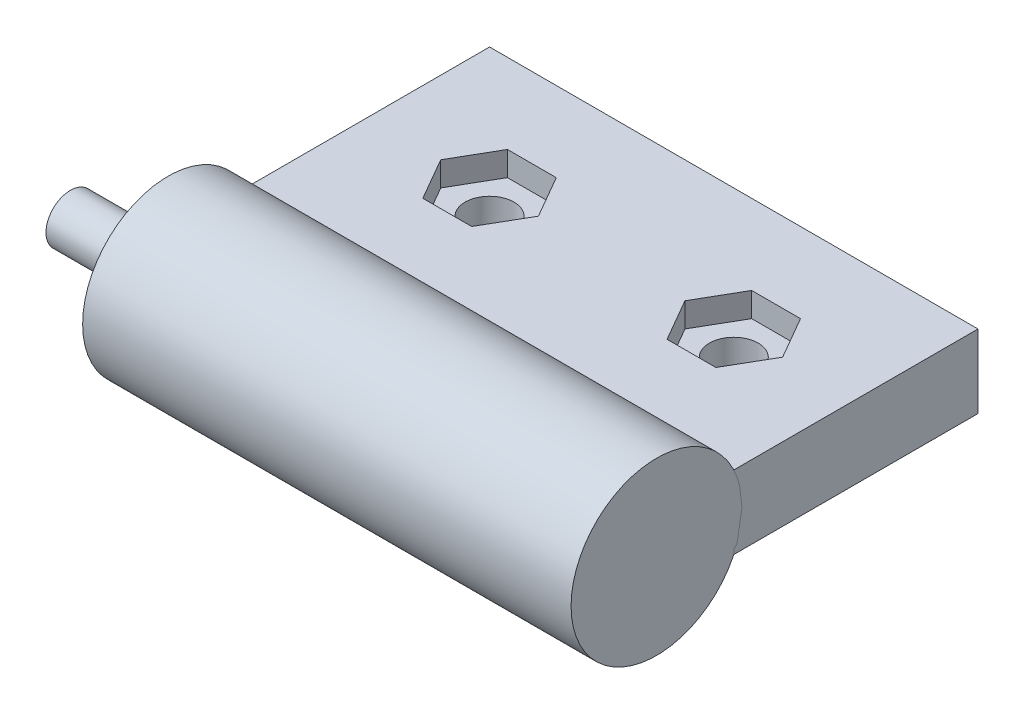
ISO-10303-21;
HEADER;
FILE_DESCRIPTION(('STEP AP214'),'2;1');
FILE_NAME('part.step','',(''),(''),'','','');
FILE_SCHEMA(('AUTOMOTIVE_DESIGN { 1 0 10303 214 1 1 1 1 }'));
ENDSEC;
DATA;
#1=APPLICATION_CONTEXT('core data for automotive mechanical design processes');
#2=APPLICATION_PROTOCOL_DEFINITION('international standard','automotive_design',2000,#1);
#3=PRODUCT_CONTEXT('',#1,'mechanical');
#4=PRODUCT('Part','Part','',(#3));
#5=PRODUCT_RELATED_PRODUCT_CATEGORY('part','',(#4));
#6=PRODUCT_DEFINITION_FORMATION('','',#4);
#7=PRODUCT_DEFINITION_CONTEXT('part definition',#1,'design');
#8=PRODUCT_DEFINITION('design','',#6,#7);
#9=PRODUCT_DEFINITION_SHAPE('','',#8);
#10=(LENGTH_UNIT() NAMED_UNIT(*) SI_UNIT(.MILLI.,.METRE.));
#11=(NAMED_UNIT(*) PLANE_ANGLE_UNIT() SI_UNIT($,.RADIAN.));
#12=(NAMED_UNIT(*) SI_UNIT($,.STERADIAN.) SOLID_ANGLE_UNIT());
#13=UNCERTAINTY_MEASURE_WITH_UNIT(LENGTH_MEASURE(1.E-05),#10,'distance_accuracy_value','');
#14=(GEOMETRIC_REPRESENTATION_CONTEXT(3) GLOBAL_UNCERTAINTY_ASSIGNED_CONTEXT((#13)) GLOBAL_UNIT_ASSIGNED_CONTEXT((#10,
#11,#12)) REPRESENTATION_CONTEXT('',''));
#15=CARTESIAN_POINT('',(0.,0.,0.));
#16=DIRECTION('',(0.,0.,1.));
#17=DIRECTION('',(1.,0.,0.));
#18=AXIS2_PLACEMENT_3D('',#15,#16,#17);
#19=CARTESIAN_POINT('',(-4.94974746830583,0.749999999999999,1.58113883008419));
#20=DIRECTION('',(1.,0.,0.));
#21=DIRECTION('',(0.,0.,-1.));
#22=AXIS2_PLACEMENT_3D('',#19,#20,#21);
#23=CYLINDRICAL_SURFACE('',#22,1.75);
#24=CARTESIAN_POINT('',(0.,0.749999999999999,1.58113883008419));
#25=DIRECTION('',(1.,0.,0.));
#26=DIRECTION('',(0.,0.,-1.));
#27=AXIS2_PLACEMENT_3D('',#24,#25,#26);
#28=CIRCLE('',#27,1.75);
#29=CARTESIAN_POINT('',(0.,0.749999999999999,-0.168861169915811));
#30=VERTEX_POINT('',#29);
#31=EDGE_CURVE('E58',#30,#30,#28,.F.);
#32=ORIENTED_EDGE('',*,*,#31,.F.);
#33=EDGE_LOOP('',(#32));
#34=FACE_BOUND('',#33,.T.);
#35=CARTESIAN_POINT('',(10.,0.749999999999999,1.58113883008419));
#36=DIRECTION('',(1.,0.,0.));
#37=DIRECTION('',(0.,0.,-1.));
#38=AXIS2_PLACEMENT_3D('',#35,#36,#37);
#39=CIRCLE('',#38,1.75);
#40=CARTESIAN_POINT('',(10.,0.749999999999999,-0.168861169915811));
#41=VERTEX_POINT('',#40);
#42=EDGE_CURVE('E68',#41,#41,#39,.T.);
#43=ORIENTED_EDGE('',*,*,#42,.F.);
#44=EDGE_LOOP('',(#43));
#45=FACE_BOUND('',#44,.T.);
#46=ADVANCED_FACE('F55',(#34,#45),#23,.T.);
#47=CARTESIAN_POINT('',(10.,0.749999999999999,1.58113883008419));
#48=DIRECTION('',(1.,0.,0.));
#49=DIRECTION('',(0.,0.,-1.));
#50=AXIS2_PLACEMENT_3D('',#47,#48,#49);
#51=PLANE('',#50);
#52=ORIENTED_EDGE('',*,*,#42,.T.);
#53=EDGE_LOOP('',(#52));
#54=FACE_BOUND('',#53,.T.);
#55=ADVANCED_FACE('F90',(#54),#51,.T.);
#56=CARTESIAN_POINT('',(0.,1.,0.));
#57=DIRECTION('',(1.,0.,0.));
#58=DIRECTION('',(0.,0.,-1.));
#59=AXIS2_PLACEMENT_3D('',#56,#57,#58);
#60=PLANE('',#59);
#61=CARTESIAN_POINT('',(0.,0.749999999999999,1.58113883008419));
#62=DIRECTION('',(-1.,0.,0.));
#63=DIRECTION('',(0.,0.,1.));
#64=AXIS2_PLACEMENT_3D('',#61,#62,#63);
#65=CIRCLE('',#64,0.5);
#66=CARTESIAN_POINT('',(0.,0.749999999999999,2.08113883008419));
#67=VERTEX_POINT('',#66);
#68=EDGE_CURVE('E11',#67,#67,#65,.T.);
#69=ORIENTED_EDGE('',*,*,#68,.F.);
#70=EDGE_LOOP('',(#69));
#71=FACE_BOUND('',#70,.T.);
#72=ORIENTED_EDGE('',*,*,#31,.T.);
#73=EDGE_LOOP('',(#72));
#74=FACE_BOUND('',#73,.T.);
#75=ADVANCED_FACE('F83',(#71,#74),#60,.F.);
#76=CARTESIAN_POINT('',(-2.,0.749999999999999,1.58113883008419));
#77=DIRECTION('',(1.,0.,0.));
#78=DIRECTION('',(0.,0.,-1.));
#79=AXIS2_PLACEMENT_3D('',#76,#77,#78);
#80=CYLINDRICAL_SURFACE('',#79,0.5);
#81=CARTESIAN_POINT('',(-2.,0.749999999999999,1.58113883008419));
#82=DIRECTION('',(-1.,0.,0.));
#83=DIRECTION('',(0.,0.,1.));
#84=AXIS2_PLACEMENT_3D('',#81,#82,#83);
#85=CIRCLE('',#84,0.5);
#86=CARTESIAN_POINT('',(-2.,0.749999999999999,2.08113883008419));
#87=VERTEX_POINT('',#86);
#88=EDGE_CURVE('E70',#87,#87,#85,.T.);
#89=ORIENTED_EDGE('',*,*,#88,.F.);
#90=EDGE_LOOP('',(#89));
#91=FACE_BOUND('',#90,.T.);
#92=ORIENTED_EDGE('',*,*,#68,.T.);
#93=EDGE_LOOP('',(#92));
#94=FACE_BOUND('',#93,.T.);
#95=ADVANCED_FACE('F81',(#91,#94),#80,.T.);
#96=CARTESIAN_POINT('',(-2.,0.749999999999999,1.58113883008419));
#97=DIRECTION('',(-1.,0.,0.));
#98=DIRECTION('',(0.,0.,1.));
#99=AXIS2_PLACEMENT_3D('',#96,#97,#98);
#100=PLANE('',#99);
#101=ORIENTED_EDGE('',*,*,#88,.T.);
#102=EDGE_LOOP('',(#101));
#103=FACE_BOUND('',#102,.T.);
#104=ADVANCED_FACE('F79',(#103),#100,.T.);
#105=CLOSED_SHELL('',(#46,#55,#75,#95,#104));
#106=MANIFOLD_SOLID_BREP('B2',#105);
#107=CARTESIAN_POINT('',(0.,1.,0.));
#108=DIRECTION('',(0.,-1.,0.));
#109=DIRECTION('',(0.,0.,-1.));
#110=AXIS2_PLACEMENT_3D('',#107,#108,#109);
#111=PLANE('',#110);
#112=CARTESIAN_POINT('',(2.5,1.,-2.5));
#113=DIRECTION('',(0.,1.,0.));
#114=DIRECTION('',(0.,0.,1.));
#115=AXIS2_PLACEMENT_3D('',#112,#113,#114);
#116=CIRCLE('',#115,0.5);
#117=CARTESIAN_POINT('',(2.5,1.,-2.));
#118=VERTEX_POINT('',#117);
#119=EDGE_CURVE('E283',#118,#118,#116,.T.);
#120=ORIENTED_EDGE('',*,*,#119,.F.);
#121=EDGE_LOOP('',(#120));
#122=FACE_BOUND('',#121,.T.);
#123=DIRECTION('',(-1.,0.,0.));
#124=VECTOR('',#123,1.);
#125=CARTESIAN_POINT('',(0.,1.,-1.63397459621556));
#126=LINE('',#125,#124);
#127=CARTESIAN_POINT('',(3.,1.,-1.63397459621556));
#128=VERTEX_POINT('',#127);
#129=CARTESIAN_POINT('',(2.,1.,-1.63397459621556));
#130=VERTEX_POINT('',#129);
#131=EDGE_CURVE('E145',#128,#130,#126,.T.);
#132=ORIENTED_EDGE('',*,*,#131,.F.);
#133=DIRECTION('',(0.499999999999998,0.,-0.86602540378444));
#134=VECTOR('',#133,1.);
#135=CARTESIAN_POINT('',(1.54246824526946,1.,0.890544456622768));
#136=LINE('',#135,#134);
#137=CARTESIAN_POINT('',(3.5,1.,-2.5));
#138=VERTEX_POINT('',#137);
#139=EDGE_CURVE('E150',#128,#138,#136,.T.);
#140=ORIENTED_EDGE('',*,*,#139,.T.);
#141=DIRECTION('',(0.499999999999998,0.,0.86602540378444));
#142=VECTOR('',#141,1.);
#143=CARTESIAN_POINT('',(3.70753175473055,1.,-2.14054445662276));
#144=LINE('',#143,#142);
#145=CARTESIAN_POINT('',(3.,1.,-3.36602540378444));
#146=VERTEX_POINT('',#145);
#147=EDGE_CURVE('E360',#146,#138,#144,.T.);
#148=ORIENTED_EDGE('',*,*,#147,.F.);
#149=DIRECTION('',(-1.,0.,0.));
#150=VECTOR('',#149,1.);
#151=CARTESIAN_POINT('',(0.,1.,-3.36602540378444));
#152=LINE('',#151,#150);
#153=CARTESIAN_POINT('',(2.,1.,-3.36602540378444));
#154=VERTEX_POINT('',#153);
#155=EDGE_CURVE('E358',#146,#154,#152,.T.);
#156=ORIENTED_EDGE('',*,*,#155,.T.);
#157=DIRECTION('',(-0.499999999999998,0.,0.86602540378444));
#158=VECTOR('',#157,1.);
#159=CARTESIAN_POINT('',(0.0424682452694592,1.,0.0245190528383332));
#160=LINE('',#159,#158);
#161=CARTESIAN_POINT('',(1.5,1.,-2.5));
#162=VERTEX_POINT('',#161);
#163=EDGE_CURVE('E356',#154,#162,#160,.T.);
#164=ORIENTED_EDGE('',*,*,#163,.T.);
#165=DIRECTION('',(-0.499999999999998,0.,-0.86602540378444));
#166=VECTOR('',#165,1.);
#167=CARTESIAN_POINT('',(2.20753175473055,1.,-1.27451905283832));
#168=LINE('',#167,#166);
#169=EDGE_CURVE('E354',#130,#162,#168,.T.);
#170=ORIENTED_EDGE('',*,*,#169,.F.);
#171=EDGE_LOOP('',(#132,#140,#148,#156,#164,#170));
#172=FACE_BOUND('',#171,.T.);
#173=ADVANCED_FACE('F130',(#122,#172),#111,.F.);
#174=DIRECTION('',(1.,0.,0.));
#175=VECTOR('',#174,1.);
#176=CARTESIAN_POINT('',(0.,1.,-3.36602540378444));
#177=LINE('',#176,#175);
#178=CARTESIAN_POINT('',(7.,1.,-3.36602540378444));
#179=VERTEX_POINT('',#178);
#180=CARTESIAN_POINT('',(8.,1.,-3.36602540378444));
#181=VERTEX_POINT('',#180);
#182=EDGE_CURVE('E366',#179,#181,#177,.T.);
#183=ORIENTED_EDGE('',*,*,#182,.F.);
#184=DIRECTION('',(-0.499999999999999,0.,0.86602540378444));
#185=VECTOR('',#184,1.);
#186=CARTESIAN_POINT('',(3.79246824526947,1.,2.18958256229942));
#187=LINE('',#186,#185);
#188=CARTESIAN_POINT('',(6.5,1.,-2.5));
#189=VERTEX_POINT('',#188);
#190=EDGE_CURVE('E364',#179,#189,#187,.T.);
#191=ORIENTED_EDGE('',*,*,#190,.T.);
#192=DIRECTION('',(-0.499999999999999,0.,-0.86602540378444));
#193=VECTOR('',#192,1.);
#194=CARTESIAN_POINT('',(5.95753175473056,1.,-3.43958256229942));
#195=LINE('',#194,#193);
#196=CARTESIAN_POINT('',(7.,1.,-1.63397459621556));
#197=VERTEX_POINT('',#196);
#198=EDGE_CURVE('E263',#197,#189,#195,.T.);
#199=ORIENTED_EDGE('',*,*,#198,.F.);
#200=DIRECTION('',(1.,0.,0.));
#201=VECTOR('',#200,1.);
#202=CARTESIAN_POINT('',(0.,1.,-1.63397459621556));
#203=LINE('',#202,#201);
#204=CARTESIAN_POINT('',(8.,1.,-1.63397459621556));
#205=VERTEX_POINT('',#204);
#206=EDGE_CURVE('E374',#197,#205,#203,.T.);
#207=ORIENTED_EDGE('',*,*,#206,.T.);
#208=DIRECTION('',(0.499999999999997,0.,-0.86602540378444));
#209=VECTOR('',#208,1.);
#210=CARTESIAN_POINT('',(5.29246824526948,1.,3.05560796608386));
#211=LINE('',#210,#209);
#212=CARTESIAN_POINT('',(8.5,1.,-2.5));
#213=VERTEX_POINT('',#212);
#214=EDGE_CURVE('E372',#205,#213,#211,.T.);
#215=ORIENTED_EDGE('',*,*,#214,.T.);
#216=DIRECTION('',(0.499999999999997,0.,0.86602540378444));
#217=VECTOR('',#216,1.);
#218=CARTESIAN_POINT('',(7.45753175473057,1.,-4.30560796608384));
#219=LINE('',#218,#217);
#220=EDGE_CURVE('E369',#181,#213,#219,.T.);
#221=ORIENTED_EDGE('',*,*,#220,.F.);
#222=EDGE_LOOP('',(#183,#191,#199,#207,#215,#221));
#223=FACE_BOUND('',#222,.T.);
#224=CARTESIAN_POINT('',(7.5,1.,-2.5));
#225=DIRECTION('',(0.,1.,0.));
#226=DIRECTION('',(0.,0.,1.));
#227=AXIS2_PLACEMENT_3D('',#224,#225,#226);
#228=CIRCLE('',#227,0.500000000000001);
#229=CARTESIAN_POINT('',(7.5,1.,-2.));
#230=VERTEX_POINT('',#229);
#231=EDGE_CURVE('E275',#230,#230,#228,.T.);
#232=ORIENTED_EDGE('',*,*,#231,.F.);
#233=EDGE_LOOP('',(#232));
#234=FACE_BOUND('',#233,.T.);
#235=ADVANCED_FACE('F426',(#223,#234),#111,.F.);
#236=CARTESIAN_POINT('',(0.,0.,0.));
#237=DIRECTION('',(0.,-1.,0.));
#238=DIRECTION('',(0.,0.,-1.));
#239=AXIS2_PLACEMENT_3D('',#236,#237,#238);
#240=PLANE('',#239);
#241=CARTESIAN_POINT('',(2.5,0.,-2.5));
#242=DIRECTION('',(0.,1.,0.));
#243=DIRECTION('',(0.,0.,1.));
#244=AXIS2_PLACEMENT_3D('',#241,#242,#243);
#245=CIRCLE('',#244,0.5);
#246=CARTESIAN_POINT('',(2.5,0.,-2.));
#247=VERTEX_POINT('',#246);
#248=EDGE_CURVE('E278',#247,#247,#245,.T.);
#249=ORIENTED_EDGE('',*,*,#248,.T.);
#250=EDGE_LOOP('',(#249));
#251=FACE_BOUND('',#250,.T.);
#252=DIRECTION('',(0.,0.,1.));
#253=VECTOR('',#252,1.);
#254=CARTESIAN_POINT('',(0.,0.,0.));
#255=LINE('',#254,#253);
#256=CARTESIAN_POINT('',(0.,0.,-5.));
#257=VERTEX_POINT('',#256);
#258=CARTESIAN_POINT('',(0.,0.,0.));
#259=VERTEX_POINT('',#258);
#260=EDGE_CURVE('E286',#257,#259,#255,.T.);
#261=ORIENTED_EDGE('',*,*,#260,.F.);
#262=DIRECTION('',(-1.,0.,0.));
#263=VECTOR('',#262,1.);
#264=CARTESIAN_POINT('',(0.,0.,-5.));
#265=LINE('',#264,#263);
#266=CARTESIAN_POINT('',(10.,0.,-5.));
#267=VERTEX_POINT('',#266);
#268=EDGE_CURVE('E295',#267,#257,#265,.T.);
#269=ORIENTED_EDGE('',*,*,#268,.F.);
#270=DIRECTION('',(0.,0.,-1.));
#271=VECTOR('',#270,1.);
#272=CARTESIAN_POINT('',(10.,0.,0.));
#273=LINE('',#272,#271);
#274=CARTESIAN_POINT('',(10.,0.,0.));
#275=VERTEX_POINT('',#274);
#276=EDGE_CURVE('E293',#275,#267,#273,.T.);
#277=ORIENTED_EDGE('',*,*,#276,.F.);
#278=DIRECTION('',(1.,0.,0.));
#279=VECTOR('',#278,1.);
#280=CARTESIAN_POINT('',(0.,0.,0.));
#281=LINE('',#280,#279);
#282=EDGE_CURVE('E291',#259,#275,#281,.T.);
#283=ORIENTED_EDGE('',*,*,#282,.F.);
#284=EDGE_LOOP('',(#261,#269,#277,#283));
#285=FACE_BOUND('',#284,.T.);
#286=CARTESIAN_POINT('',(7.5,0.,-2.5));
#287=DIRECTION('',(0.,1.,0.));
#288=DIRECTION('',(0.,0.,1.));
#289=AXIS2_PLACEMENT_3D('',#286,#287,#288);
#290=CIRCLE('',#289,0.500000000000001);
#291=CARTESIAN_POINT('',(7.5,0.,-2.));
#292=VERTEX_POINT('',#291);
#293=EDGE_CURVE('E279',#292,#292,#290,.T.);
#294=ORIENTED_EDGE('',*,*,#293,.T.);
#295=EDGE_LOOP('',(#294));
#296=FACE_BOUND('',#295,.T.);
#297=ADVANCED_FACE('F315',(#251,#285,#296),#240,.T.);
#298=CARTESIAN_POINT('',(0.,1.,0.));
#299=DIRECTION('',(1.,0.,0.));
#300=DIRECTION('',(0.,0.,-1.));
#301=AXIS2_PLACEMENT_3D('',#298,#299,#300);
#302=PLANE('',#301);
#303=ORIENTED_EDGE('',*,*,#260,.T.);
#304=DIRECTION('',(0.,-1.,0.));
#305=VECTOR('',#304,1.);
#306=CARTESIAN_POINT('',(0.,1.,0.));
#307=LINE('',#306,#305);
#308=CARTESIAN_POINT('',(0.,1.5,0.));
#309=VERTEX_POINT('',#308);
#310=EDGE_CURVE('E53',#309,#259,#307,.T.);
#311=ORIENTED_EDGE('',*,*,#310,.F.);
#312=DIRECTION('',(0.,0.,1.));
#313=VECTOR('',#312,1.);
#314=CARTESIAN_POINT('',(0.,1.5,0.));
#315=LINE('',#314,#313);
#316=CARTESIAN_POINT('',(0.,1.5,-5.));
#317=VERTEX_POINT('',#316);
#318=EDGE_CURVE('E323',#317,#309,#315,.T.);
#319=ORIENTED_EDGE('',*,*,#318,.F.);
#320=DIRECTION('',(0.,-1.,0.));
#321=VECTOR('',#320,1.);
#322=CARTESIAN_POINT('',(0.,1.,-5.));
#323=LINE('',#322,#321);
#324=EDGE_CURVE('E297',#317,#257,#323,.T.);
#325=ORIENTED_EDGE('',*,*,#324,.T.);
#326=EDGE_LOOP('',(#303,#311,#319,#325));
#327=FACE_BOUND('',#326,.T.);
#328=ADVANCED_FACE('F132',(#327),#302,.F.);
#329=CARTESIAN_POINT('',(0.,1.,0.));
#330=DIRECTION('',(0.,0.,-1.));
#331=DIRECTION('',(-1.,0.,0.));
#332=AXIS2_PLACEMENT_3D('',#329,#330,#331);
#333=PLANE('',#332);
#334=ORIENTED_EDGE('',*,*,#282,.T.);
#335=DIRECTION('',(0.,-1.,0.));
#336=VECTOR('',#335,1.);
#337=CARTESIAN_POINT('',(10.,1.,0.));
#338=LINE('',#337,#336);
#339=CARTESIAN_POINT('',(10.,1.5,0.));
#340=VERTEX_POINT('',#339);
#341=EDGE_CURVE('E138',#340,#275,#338,.T.);
#342=ORIENTED_EDGE('',*,*,#341,.F.);
#343=DIRECTION('',(1.,0.,0.));
#344=VECTOR('',#343,1.);
#345=CARTESIAN_POINT('',(0.,1.5,0.));
#346=LINE('',#345,#344);
#347=EDGE_CURVE('E325',#309,#340,#346,.T.);
#348=ORIENTED_EDGE('',*,*,#347,.F.);
#349=ORIENTED_EDGE('',*,*,#310,.T.);
#350=EDGE_LOOP('',(#334,#342,#348,#349));
#351=FACE_BOUND('',#350,.T.);
#352=ADVANCED_FACE('F445',(#351),#333,.F.);
#353=CARTESIAN_POINT('',(10.,1.,0.));
#354=DIRECTION('',(-1.,0.,0.));
#355=DIRECTION('',(0.,0.,1.));
#356=AXIS2_PLACEMENT_3D('',#353,#354,#355);
#357=PLANE('',#356);
#358=ORIENTED_EDGE('',*,*,#276,.T.);
#359=DIRECTION('',(0.,-1.,0.));
#360=VECTOR('',#359,1.);
#361=CARTESIAN_POINT('',(10.,1.,-5.));
#362=LINE('',#361,#360);
#363=CARTESIAN_POINT('',(10.,1.5,-5.));
#364=VERTEX_POINT('',#363);
#365=EDGE_CURVE('E300',#364,#267,#362,.T.);
#366=ORIENTED_EDGE('',*,*,#365,.F.);
#367=DIRECTION('',(0.,0.,-1.));
#368=VECTOR('',#367,1.);
#369=CARTESIAN_POINT('',(10.,1.5,0.));
#370=LINE('',#369,#368);
#371=EDGE_CURVE('E308',#340,#364,#370,.T.);
#372=ORIENTED_EDGE('',*,*,#371,.F.);
#373=ORIENTED_EDGE('',*,*,#341,.T.);
#374=EDGE_LOOP('',(#358,#366,#372,#373));
#375=FACE_BOUND('',#374,.T.);
#376=ADVANCED_FACE('F306',(#375),#357,.F.);
#377=CARTESIAN_POINT('',(0.,1.,-5.));
#378=DIRECTION('',(0.,0.,1.));
#379=DIRECTION('',(1.,0.,0.));
#380=AXIS2_PLACEMENT_3D('',#377,#378,#379);
#381=PLANE('',#380);
#382=ORIENTED_EDGE('',*,*,#268,.T.);
#383=ORIENTED_EDGE('',*,*,#324,.F.);
#384=DIRECTION('',(-1.,0.,0.));
#385=VECTOR('',#384,1.);
#386=CARTESIAN_POINT('',(0.,1.5,-5.));
#387=LINE('',#386,#385);
#388=EDGE_CURVE('E326',#364,#317,#387,.T.);
#389=ORIENTED_EDGE('',*,*,#388,.F.);
#390=ORIENTED_EDGE('',*,*,#365,.T.);
#391=EDGE_LOOP('',(#382,#383,#389,#390));
#392=FACE_BOUND('',#391,.T.);
#393=ADVANCED_FACE('F318',(#392),#381,.F.);
#394=CARTESIAN_POINT('',(2.5,1.,-2.5));
#395=DIRECTION('',(0.,-1.,0.));
#396=DIRECTION('',(0.,0.,-1.));
#397=AXIS2_PLACEMENT_3D('',#394,#395,#396);
#398=CYLINDRICAL_SURFACE('',#397,0.5);
#399=ORIENTED_EDGE('',*,*,#119,.T.);
#400=EDGE_LOOP('',(#399));
#401=FACE_BOUND('',#400,.T.);
#402=ORIENTED_EDGE('',*,*,#248,.F.);
#403=EDGE_LOOP('',(#402));
#404=FACE_BOUND('',#403,.T.);
#405=ADVANCED_FACE('F437',(#401,#404),#398,.F.);
#406=CARTESIAN_POINT('',(7.5,1.,-2.5));
#407=DIRECTION('',(0.,-1.,0.));
#408=DIRECTION('',(0.,0.,-1.));
#409=AXIS2_PLACEMENT_3D('',#406,#407,#408);
#410=CYLINDRICAL_SURFACE('',#409,0.500000000000001);
#411=ORIENTED_EDGE('',*,*,#231,.T.);
#412=EDGE_LOOP('',(#411));
#413=FACE_BOUND('',#412,.T.);
#414=ORIENTED_EDGE('',*,*,#293,.F.);
#415=EDGE_LOOP('',(#414));
#416=FACE_BOUND('',#415,.T.);
#417=ADVANCED_FACE('F501',(#413,#416),#410,.F.);
#418=CARTESIAN_POINT('',(3.79246824526947,1.5,2.18958256229942));
#419=DIRECTION('',(0.86602540378444,0.,0.499999999999999));
#420=DIRECTION('',(0.499999999999999,0.,-0.86602540378444));
#421=AXIS2_PLACEMENT_3D('',#418,#419,#420);
#422=PLANE('',#421);
#423=ORIENTED_EDGE('',*,*,#190,.F.);
#424=DIRECTION('',(0.,-1.,0.));
#425=VECTOR('',#424,1.);
#426=CARTESIAN_POINT('',(7.,1.5,-3.36602540378444));
#427=LINE('',#426,#425);
#428=CARTESIAN_POINT('',(7.,1.5,-3.36602540378444));
#429=VERTEX_POINT('',#428);
#430=EDGE_CURVE('E282',#429,#179,#427,.T.);
#431=ORIENTED_EDGE('',*,*,#430,.F.);
#432=DIRECTION('',(-0.499999999999999,0.,0.86602540378444));
#433=VECTOR('',#432,1.);
#434=CARTESIAN_POINT('',(3.79246824526947,1.5,2.18958256229942));
#435=LINE('',#434,#433);
#436=CARTESIAN_POINT('',(6.5,1.5,-2.5));
#437=VERTEX_POINT('',#436);
#438=EDGE_CURVE('E336',#429,#437,#435,.T.);
#439=ORIENTED_EDGE('',*,*,#438,.T.);
#440=DIRECTION('',(0.,-1.,0.));
#441=VECTOR('',#440,1.);
#442=CARTESIAN_POINT('',(6.5,1.5,-2.5));
#443=LINE('',#442,#441);
#444=EDGE_CURVE('E266',#437,#189,#443,.T.);
#445=ORIENTED_EDGE('',*,*,#444,.T.);
#446=EDGE_LOOP('',(#423,#431,#439,#445));
#447=FACE_BOUND('',#446,.T.);
#448=ADVANCED_FACE('F508',(#447),#422,.T.);
#449=CARTESIAN_POINT('',(0.,1.5,-3.36602540378444));
#450=DIRECTION('',(0.,0.,-1.));
#451=DIRECTION('',(-1.,0.,0.));
#452=AXIS2_PLACEMENT_3D('',#449,#450,#451);
#453=PLANE('',#452);
#454=ORIENTED_EDGE('',*,*,#182,.T.);
#455=DIRECTION('',(0.,-1.,0.));
#456=VECTOR('',#455,1.);
#457=CARTESIAN_POINT('',(8.,1.5,-3.36602540378444));
#458=LINE('',#457,#456);
#459=CARTESIAN_POINT('',(8.,1.5,-3.36602540378444));
#460=VERTEX_POINT('',#459);
#461=EDGE_CURVE('E386',#460,#181,#458,.T.);
#462=ORIENTED_EDGE('',*,*,#461,.F.);
#463=DIRECTION('',(1.,0.,0.));
#464=VECTOR('',#463,1.);
#465=CARTESIAN_POINT('',(0.,1.5,-3.36602540378444));
#466=LINE('',#465,#464);
#467=EDGE_CURVE('E339',#429,#460,#466,.T.);
#468=ORIENTED_EDGE('',*,*,#467,.F.);
#469=ORIENTED_EDGE('',*,*,#430,.T.);
#470=EDGE_LOOP('',(#454,#462,#468,#469));
#471=FACE_BOUND('',#470,.T.);
#472=ADVANCED_FACE('F521',(#471),#453,.F.);
#473=CARTESIAN_POINT('',(7.45753175473057,1.5,-4.30560796608384));
#474=DIRECTION('',(0.86602540378444,0.,-0.499999999999997));
#475=DIRECTION('',(-0.499999999999997,0.,-0.86602540378444));
#476=AXIS2_PLACEMENT_3D('',#473,#474,#475);
#477=PLANE('',#476);
#478=ORIENTED_EDGE('',*,*,#220,.T.);
#479=DIRECTION('',(0.,-1.,0.));
#480=VECTOR('',#479,1.);
#481=CARTESIAN_POINT('',(8.5,1.5,-2.5));
#482=LINE('',#481,#480);
#483=CARTESIAN_POINT('',(8.5,1.5,-2.5));
#484=VERTEX_POINT('',#483);
#485=EDGE_CURVE('E383',#484,#213,#482,.T.);
#486=ORIENTED_EDGE('',*,*,#485,.F.);
#487=DIRECTION('',(0.499999999999997,0.,0.86602540378444));
#488=VECTOR('',#487,1.);
#489=CARTESIAN_POINT('',(7.45753175473057,1.5,-4.30560796608384));
#490=LINE('',#489,#488);
#491=EDGE_CURVE('E342',#460,#484,#490,.T.);
#492=ORIENTED_EDGE('',*,*,#491,.F.);
#493=ORIENTED_EDGE('',*,*,#461,.T.);
#494=EDGE_LOOP('',(#478,#486,#492,#493));
#495=FACE_BOUND('',#494,.T.);
#496=ADVANCED_FACE('F529',(#495),#477,.F.);
#497=CARTESIAN_POINT('',(5.29246824526948,1.5,3.05560796608386));
#498=DIRECTION('',(-0.86602540378444,0.,-0.499999999999997));
#499=DIRECTION('',(-0.499999999999997,0.,0.86602540378444));
#500=AXIS2_PLACEMENT_3D('',#497,#498,#499);
#501=PLANE('',#500);
#502=ORIENTED_EDGE('',*,*,#214,.F.);
#503=DIRECTION('',(0.,-1.,0.));
#504=VECTOR('',#503,1.);
#505=CARTESIAN_POINT('',(8.,1.5,-1.63397459621556));
#506=LINE('',#505,#504);
#507=CARTESIAN_POINT('',(8.,1.5,-1.63397459621556));
#508=VERTEX_POINT('',#507);
#509=EDGE_CURVE('E380',#508,#205,#506,.T.);
#510=ORIENTED_EDGE('',*,*,#509,.F.);
#511=DIRECTION('',(0.499999999999997,0.,-0.86602540378444));
#512=VECTOR('',#511,1.);
#513=CARTESIAN_POINT('',(5.29246824526948,1.5,3.05560796608386));
#514=LINE('',#513,#512);
#515=EDGE_CURVE('E344',#508,#484,#514,.T.);
#516=ORIENTED_EDGE('',*,*,#515,.T.);
#517=ORIENTED_EDGE('',*,*,#485,.T.);
#518=EDGE_LOOP('',(#502,#510,#516,#517));
#519=FACE_BOUND('',#518,.T.);
#520=ADVANCED_FACE('F538',(#519),#501,.T.);
#521=CARTESIAN_POINT('',(0.,1.5,-1.63397459621556));
#522=DIRECTION('',(0.,0.,-1.));
#523=DIRECTION('',(-1.,0.,0.));
#524=AXIS2_PLACEMENT_3D('',#521,#522,#523);
#525=PLANE('',#524);
#526=ORIENTED_EDGE('',*,*,#206,.F.);
#527=DIRECTION('',(0.,-1.,0.));
#528=VECTOR('',#527,1.);
#529=CARTESIAN_POINT('',(7.,1.5,-1.63397459621556));
#530=LINE('',#529,#528);
#531=CARTESIAN_POINT('',(7.,1.5,-1.63397459621556));
#532=VERTEX_POINT('',#531);
#533=EDGE_CURVE('E269',#532,#197,#530,.T.);
#534=ORIENTED_EDGE('',*,*,#533,.F.);
#535=DIRECTION('',(1.,0.,0.));
#536=VECTOR('',#535,1.);
#537=CARTESIAN_POINT('',(0.,1.5,-1.63397459621556));
#538=LINE('',#537,#536);
#539=EDGE_CURVE('E347',#532,#508,#538,.T.);
#540=ORIENTED_EDGE('',*,*,#539,.T.);
#541=ORIENTED_EDGE('',*,*,#509,.T.);
#542=EDGE_LOOP('',(#526,#534,#540,#541));
#543=FACE_BOUND('',#542,.T.);
#544=ADVANCED_FACE('F547',(#543),#525,.T.);
#545=CARTESIAN_POINT('',(0.,1.5,-1.63397459621556));
#546=DIRECTION('',(0.,0.,1.));
#547=DIRECTION('',(1.,0.,0.));
#548=AXIS2_PLACEMENT_3D('',#545,#546,#547);
#549=PLANE('',#548);
#550=ORIENTED_EDGE('',*,*,#131,.T.);
#551=DIRECTION('',(0.,-1.,0.));
#552=VECTOR('',#551,1.);
#553=CARTESIAN_POINT('',(2.,1.5,-1.63397459621556));
#554=LINE('',#553,#552);
#555=CARTESIAN_POINT('',(2.,1.5,-1.63397459621556));
#556=VERTEX_POINT('',#555);
#557=EDGE_CURVE('E247',#556,#130,#554,.T.);
#558=ORIENTED_EDGE('',*,*,#557,.F.);
#559=DIRECTION('',(-1.,0.,0.));
#560=VECTOR('',#559,1.);
#561=CARTESIAN_POINT('',(0.,1.5,-1.63397459621556));
#562=LINE('',#561,#560);
#563=CARTESIAN_POINT('',(3.,1.5,-1.63397459621556));
#564=VERTEX_POINT('',#563);
#565=EDGE_CURVE('E254',#564,#556,#562,.T.);
#566=ORIENTED_EDGE('',*,*,#565,.F.);
#567=DIRECTION('',(0.,-1.,0.));
#568=VECTOR('',#567,1.);
#569=CARTESIAN_POINT('',(3.,1.5,-1.63397459621556));
#570=LINE('',#569,#568);
#571=EDGE_CURVE('E352',#564,#128,#570,.T.);
#572=ORIENTED_EDGE('',*,*,#571,.T.);
#573=EDGE_LOOP('',(#550,#558,#566,#572));
#574=FACE_BOUND('',#573,.T.);
#575=ADVANCED_FACE('F265',(#574),#549,.F.);
#576=CARTESIAN_POINT('',(2.20753175473055,1.5,-1.27451905283832));
#577=DIRECTION('',(-0.86602540378444,0.,0.499999999999998));
#578=DIRECTION('',(0.499999999999998,0.,0.86602540378444));
#579=AXIS2_PLACEMENT_3D('',#576,#577,#578);
#580=PLANE('',#579);
#581=ORIENTED_EDGE('',*,*,#169,.T.);
#582=DIRECTION('',(0.,-1.,0.));
#583=VECTOR('',#582,1.);
#584=CARTESIAN_POINT('',(1.5,1.5,-2.5));
#585=LINE('',#584,#583);
#586=CARTESIAN_POINT('',(1.5,1.5,-2.5));
#587=VERTEX_POINT('',#586);
#588=EDGE_CURVE('E249',#587,#162,#585,.T.);
#589=ORIENTED_EDGE('',*,*,#588,.F.);
#590=DIRECTION('',(-0.499999999999998,0.,-0.86602540378444));
#591=VECTOR('',#590,1.);
#592=CARTESIAN_POINT('',(2.20753175473055,1.5,-1.27451905283832));
#593=LINE('',#592,#591);
#594=EDGE_CURVE('E242',#556,#587,#593,.T.);
#595=ORIENTED_EDGE('',*,*,#594,.F.);
#596=ORIENTED_EDGE('',*,*,#557,.T.);
#597=EDGE_LOOP('',(#581,#589,#595,#596));
#598=FACE_BOUND('',#597,.T.);
#599=ADVANCED_FACE('F245',(#598),#580,.F.);
#600=CARTESIAN_POINT('',(0.0424682452694592,1.5,0.0245190528383332));
#601=DIRECTION('',(0.86602540378444,0.,0.499999999999998));
#602=DIRECTION('',(0.499999999999998,0.,-0.86602540378444));
#603=AXIS2_PLACEMENT_3D('',#600,#601,#602);
#604=PLANE('',#603);
#605=ORIENTED_EDGE('',*,*,#163,.F.);
#606=DIRECTION('',(0.,-1.,0.));
#607=VECTOR('',#606,1.);
#608=CARTESIAN_POINT('',(2.,1.5,-3.36602540378444));
#609=LINE('',#608,#607);
#610=CARTESIAN_POINT('',(2.,1.5,-3.36602540378444));
#611=VERTEX_POINT('',#610);
#612=EDGE_CURVE('E271',#611,#154,#609,.T.);
#613=ORIENTED_EDGE('',*,*,#612,.F.);
#614=DIRECTION('',(-0.499999999999998,0.,0.86602540378444));
#615=VECTOR('',#614,1.);
#616=CARTESIAN_POINT('',(0.0424682452694592,1.5,0.0245190528383332));
#617=LINE('',#616,#615);
#618=EDGE_CURVE('E253',#611,#587,#617,.T.);
#619=ORIENTED_EDGE('',*,*,#618,.T.);
#620=ORIENTED_EDGE('',*,*,#588,.T.);
#621=EDGE_LOOP('',(#605,#613,#619,#620));
#622=FACE_BOUND('',#621,.T.);
#623=ADVANCED_FACE('F405',(#622),#604,.T.);
#624=CARTESIAN_POINT('',(0.,1.5,-3.36602540378444));
#625=DIRECTION('',(0.,0.,1.));
#626=DIRECTION('',(1.,0.,0.));
#627=AXIS2_PLACEMENT_3D('',#624,#625,#626);
#628=PLANE('',#627);
#629=ORIENTED_EDGE('',*,*,#155,.F.);
#630=DIRECTION('',(0.,-1.,0.));
#631=VECTOR('',#630,1.);
#632=CARTESIAN_POINT('',(3.,1.5,-3.36602540378444));
#633=LINE('',#632,#631);
#634=CARTESIAN_POINT('',(3.,1.5,-3.36602540378444));
#635=VERTEX_POINT('',#634);
#636=EDGE_CURVE('E394',#635,#146,#633,.T.);
#637=ORIENTED_EDGE('',*,*,#636,.F.);
#638=DIRECTION('',(-1.,0.,0.));
#639=VECTOR('',#638,1.);
#640=CARTESIAN_POINT('',(0.,1.5,-3.36602540378444));
#641=LINE('',#640,#639);
#642=EDGE_CURVE('E403',#635,#611,#641,.T.);
#643=ORIENTED_EDGE('',*,*,#642,.T.);
#644=ORIENTED_EDGE('',*,*,#612,.T.);
#645=EDGE_LOOP('',(#629,#637,#643,#644));
#646=FACE_BOUND('',#645,.T.);
#647=ADVANCED_FACE('F401',(#646),#628,.T.);
#648=CARTESIAN_POINT('',(3.70753175473055,1.5,-2.14054445662276));
#649=DIRECTION('',(0.86602540378444,0.,-0.499999999999998));
#650=DIRECTION('',(-0.499999999999998,0.,-0.86602540378444));
#651=AXIS2_PLACEMENT_3D('',#648,#649,#650);
#652=PLANE('',#651);
#653=ORIENTED_EDGE('',*,*,#147,.T.);
#654=DIRECTION('',(0.,-1.,0.));
#655=VECTOR('',#654,1.);
#656=CARTESIAN_POINT('',(3.5,1.5,-2.5));
#657=LINE('',#656,#655);
#658=CARTESIAN_POINT('',(3.5,1.5,-2.5));
#659=VERTEX_POINT('',#658);
#660=EDGE_CURVE('E392',#659,#138,#657,.T.);
#661=ORIENTED_EDGE('',*,*,#660,.F.);
#662=DIRECTION('',(0.499999999999998,0.,0.86602540378444));
#663=VECTOR('',#662,1.);
#664=CARTESIAN_POINT('',(3.70753175473055,1.5,-2.14054445662276));
#665=LINE('',#664,#663);
#666=EDGE_CURVE('E330',#635,#659,#665,.T.);
#667=ORIENTED_EDGE('',*,*,#666,.F.);
#668=ORIENTED_EDGE('',*,*,#636,.T.);
#669=EDGE_LOOP('',(#653,#661,#667,#668));
#670=FACE_BOUND('',#669,.T.);
#671=ADVANCED_FACE('F409',(#670),#652,.F.);
#672=CARTESIAN_POINT('',(1.54246824526946,1.5,0.890544456622768));
#673=DIRECTION('',(-0.86602540378444,0.,-0.499999999999998));
#674=DIRECTION('',(-0.499999999999998,0.,0.86602540378444));
#675=AXIS2_PLACEMENT_3D('',#672,#673,#674);
#676=PLANE('',#675);
#677=ORIENTED_EDGE('',*,*,#139,.F.);
#678=ORIENTED_EDGE('',*,*,#571,.F.);
#679=DIRECTION('',(0.499999999999998,0.,-0.86602540378444));
#680=VECTOR('',#679,1.);
#681=CARTESIAN_POINT('',(1.54246824526946,1.5,0.890544456622768));
#682=LINE('',#681,#680);
#683=EDGE_CURVE('E261',#564,#659,#682,.T.);
#684=ORIENTED_EDGE('',*,*,#683,.T.);
#685=ORIENTED_EDGE('',*,*,#660,.T.);
#686=EDGE_LOOP('',(#677,#678,#684,#685));
#687=FACE_BOUND('',#686,.T.);
#688=ADVANCED_FACE('F413',(#687),#676,.T.);
#689=CARTESIAN_POINT('',(5.95753175473056,1.5,-3.43958256229942));
#690=DIRECTION('',(-0.866025403784439,0.,0.499999999999999));
#691=DIRECTION('',(0.499999999999999,0.,0.86602540378444));
#692=AXIS2_PLACEMENT_3D('',#689,#690,#691);
#693=PLANE('',#692);
#694=ORIENTED_EDGE('',*,*,#198,.T.);
#695=ORIENTED_EDGE('',*,*,#444,.F.);
#696=DIRECTION('',(-0.499999999999999,0.,-0.86602540378444));
#697=VECTOR('',#696,1.);
#698=CARTESIAN_POINT('',(5.95753175473056,1.5,-3.43958256229942));
#699=LINE('',#698,#697);
#700=EDGE_CURVE('E350',#532,#437,#699,.T.);
#701=ORIENTED_EDGE('',*,*,#700,.F.);
#702=ORIENTED_EDGE('',*,*,#533,.T.);
#703=EDGE_LOOP('',(#694,#695,#701,#702));
#704=FACE_BOUND('',#703,.T.);
#705=ADVANCED_FACE('F415',(#704),#693,.F.);
#706=CARTESIAN_POINT('',(0.,1.5,0.));
#707=DIRECTION('',(0.,1.,0.));
#708=DIRECTION('',(0.,0.,1.));
#709=AXIS2_PLACEMENT_3D('',#706,#707,#708);
#710=PLANE('',#709);
#711=ORIENTED_EDGE('',*,*,#565,.T.);
#712=ORIENTED_EDGE('',*,*,#594,.T.);
#713=ORIENTED_EDGE('',*,*,#618,.F.);
#714=ORIENTED_EDGE('',*,*,#642,.F.);
#715=ORIENTED_EDGE('',*,*,#666,.T.);
#716=ORIENTED_EDGE('',*,*,#683,.F.);
#717=EDGE_LOOP('',(#711,#712,#713,#714,#715,#716));
#718=FACE_BOUND('',#717,.T.);
#719=ORIENTED_EDGE('',*,*,#388,.T.);
#720=ORIENTED_EDGE('',*,*,#318,.T.);
#721=ORIENTED_EDGE('',*,*,#347,.T.);
#722=ORIENTED_EDGE('',*,*,#371,.T.);
#723=EDGE_LOOP('',(#719,#720,#721,#722));
#724=FACE_BOUND('',#723,.T.);
#725=ORIENTED_EDGE('',*,*,#438,.F.);
#726=ORIENTED_EDGE('',*,*,#467,.T.);
#727=ORIENTED_EDGE('',*,*,#491,.T.);
#728=ORIENTED_EDGE('',*,*,#515,.F.);
#729=ORIENTED_EDGE('',*,*,#539,.F.);
#730=ORIENTED_EDGE('',*,*,#700,.T.);
#731=EDGE_LOOP('',(#725,#726,#727,#728,#729,#730));
#732=FACE_BOUND('',#731,.T.);
#733=ADVANCED_FACE('F258',(#718,#724,#732),#710,.T.);
#734=CLOSED_SHELL('',(#173,#235,#297,#328,#352,#376,#393,#405,#417,#448,#472,#496,#520,#544,
#575,#599,#623,#647,#671,#688,#705,#733));
#735=MANIFOLD_SOLID_BREP('B6',#734);
#736=ADVANCED_BREP_SHAPE_REPRESENTATION('',(#18,#106,#735),#14);
#737=SHAPE_DEFINITION_REPRESENTATION(#9,#736);
ENDSEC;
END-ISO-10303-21;
